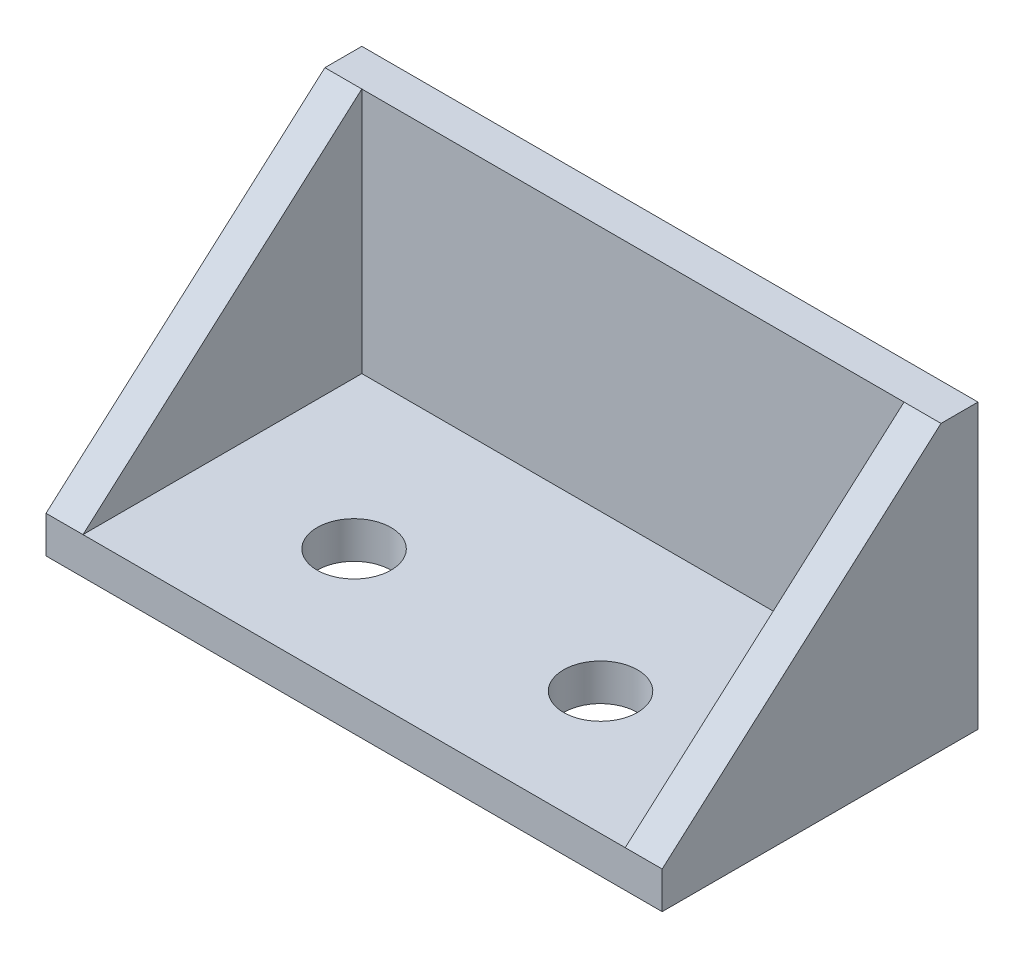
ISO-10303-21;
HEADER;
FILE_DESCRIPTION(('STEP AP214'),'2;1');
FILE_NAME('part.step','',(''),(''),'','','');
FILE_SCHEMA(('AUTOMOTIVE_DESIGN { 1 0 10303 214 1 1 1 1 }'));
ENDSEC;
DATA;
#1=APPLICATION_CONTEXT('core data for automotive mechanical design processes');
#2=APPLICATION_PROTOCOL_DEFINITION('international standard','automotive_design',2000,#1);
#3=PRODUCT_CONTEXT('',#1,'mechanical');
#4=PRODUCT('Part','Part','',(#3));
#5=PRODUCT_RELATED_PRODUCT_CATEGORY('part','',(#4));
#6=PRODUCT_DEFINITION_FORMATION('','',#4);
#7=PRODUCT_DEFINITION_CONTEXT('part definition',#1,'design');
#8=PRODUCT_DEFINITION('design','',#6,#7);
#9=PRODUCT_DEFINITION_SHAPE('','',#8);
#10=(LENGTH_UNIT() NAMED_UNIT(*) SI_UNIT(.MILLI.,.METRE.));
#11=(NAMED_UNIT(*) PLANE_ANGLE_UNIT() SI_UNIT($,.RADIAN.));
#12=(NAMED_UNIT(*) SI_UNIT($,.STERADIAN.) SOLID_ANGLE_UNIT());
#13=UNCERTAINTY_MEASURE_WITH_UNIT(LENGTH_MEASURE(1.E-05),#10,'distance_accuracy_value','');
#14=(GEOMETRIC_REPRESENTATION_CONTEXT(3) GLOBAL_UNCERTAINTY_ASSIGNED_CONTEXT((#13)) GLOBAL_UNIT_ASSIGNED_CONTEXT((#10,
#11,#12)) REPRESENTATION_CONTEXT('',''));
#15=CARTESIAN_POINT('',(0.,0.,0.));
#16=DIRECTION('',(0.,0.,1.));
#17=DIRECTION('',(1.,0.,0.));
#18=AXIS2_PLACEMENT_3D('',#15,#16,#17);
#19=CARTESIAN_POINT('',(0.,3.,0.));
#20=DIRECTION('',(0.,-1.,0.));
#21=DIRECTION('',(0.,0.,-1.));
#22=AXIS2_PLACEMENT_3D('',#19,#20,#21);
#23=PLANE('',#22);
#24=CARTESIAN_POINT('',(-10.,3.,10.));
#25=DIRECTION('',(0.,1.,0.));
#26=DIRECTION('',(0.,0.,1.));
#27=AXIS2_PLACEMENT_3D('',#24,#25,#26);
#28=CIRCLE('',#27,3.);
#29=CARTESIAN_POINT('',(-10.,3.,13.));
#30=VERTEX_POINT('',#29);
#31=EDGE_CURVE('E231',#30,#30,#28,.T.);
#32=ORIENTED_EDGE('',*,*,#31,.F.);
#33=EDGE_LOOP('',(#32));
#34=FACE_BOUND('',#33,.T.);
#35=CARTESIAN_POINT('',(10.,3.,10.));
#36=DIRECTION('',(0.,1.,0.));
#37=DIRECTION('',(0.,0.,-1.));
#38=AXIS2_PLACEMENT_3D('',#35,#36,#37);
#39=CIRCLE('',#38,3.);
#40=CARTESIAN_POINT('',(10.,3.,7.));
#41=VERTEX_POINT('',#40);
#42=EDGE_CURVE('E223',#41,#41,#39,.T.);
#43=ORIENTED_EDGE('',*,*,#42,.F.);
#44=EDGE_LOOP('',(#43));
#45=FACE_BOUND('',#44,.T.);
#46=DIRECTION('',(0.,0.,1.));
#47=VECTOR('',#46,1.);
#48=CARTESIAN_POINT('',(22.,3.,20.));
#49=LINE('',#48,#47);
#50=CARTESIAN_POINT('',(22.,3.,-2.63));
#51=VERTEX_POINT('',#50);
#52=CARTESIAN_POINT('',(22.,3.,20.));
#53=VERTEX_POINT('',#52);
#54=EDGE_CURVE('E110',#51,#53,#49,.T.);
#55=ORIENTED_EDGE('',*,*,#54,.F.);
#56=DIRECTION('',(1.,0.,0.));
#57=VECTOR('',#56,1.);
#58=CARTESIAN_POINT('',(-25.,3.,-2.63));
#59=LINE('',#58,#57);
#60=CARTESIAN_POINT('',(-22.,3.,-2.63));
#61=VERTEX_POINT('',#60);
#62=EDGE_CURVE('E135',#61,#51,#59,.T.);
#63=ORIENTED_EDGE('',*,*,#62,.F.);
#64=DIRECTION('',(0.,0.,1.));
#65=VECTOR('',#64,1.);
#66=CARTESIAN_POINT('',(-22.,3.,20.));
#67=LINE('',#66,#65);
#68=CARTESIAN_POINT('',(-22.,3.,20.));
#69=VERTEX_POINT('',#68);
#70=EDGE_CURVE('E205',#61,#69,#67,.T.);
#71=ORIENTED_EDGE('',*,*,#70,.T.);
#72=DIRECTION('',(1.,0.,0.));
#73=VECTOR('',#72,1.);
#74=CARTESIAN_POINT('',(-25.,3.,20.));
#75=LINE('',#74,#73);
#76=EDGE_CURVE('E162',#69,#53,#75,.T.);
#77=ORIENTED_EDGE('',*,*,#76,.T.);
#78=EDGE_LOOP('',(#55,#63,#71,#77));
#79=FACE_BOUND('',#78,.T.);
#80=ADVANCED_FACE('F39',(#34,#45,#79),#23,.F.);
#81=CARTESIAN_POINT('',(-25.,23.,-2.63));
#82=DIRECTION('',(0.,0.,-1.));
#83=DIRECTION('',(-1.,0.,0.));
#84=AXIS2_PLACEMENT_3D('',#81,#82,#83);
#85=PLANE('',#84);
#86=DIRECTION('',(0.,-1.,0.));
#87=VECTOR('',#86,1.);
#88=CARTESIAN_POINT('',(22.,3.,-2.63));
#89=LINE('',#88,#87);
#90=CARTESIAN_POINT('',(22.,23.,-2.63));
#91=VERTEX_POINT('',#90);
#92=EDGE_CURVE('E108',#91,#51,#89,.T.);
#93=ORIENTED_EDGE('',*,*,#92,.F.);
#94=DIRECTION('',(1.,0.,0.));
#95=VECTOR('',#94,1.);
#96=CARTESIAN_POINT('',(-25.,23.,-2.63));
#97=LINE('',#96,#95);
#98=CARTESIAN_POINT('',(-22.,23.,-2.63));
#99=VERTEX_POINT('',#98);
#100=EDGE_CURVE('E132',#99,#91,#97,.T.);
#101=ORIENTED_EDGE('',*,*,#100,.F.);
#102=DIRECTION('',(0.,-1.,0.));
#103=VECTOR('',#102,1.);
#104=CARTESIAN_POINT('',(-22.,3.,-2.63));
#105=LINE('',#104,#103);
#106=EDGE_CURVE('E206',#99,#61,#105,.T.);
#107=ORIENTED_EDGE('',*,*,#106,.T.);
#108=ORIENTED_EDGE('',*,*,#62,.T.);
#109=EDGE_LOOP('',(#93,#101,#107,#108));
#110=FACE_BOUND('',#109,.T.);
#111=ADVANCED_FACE('F130',(#110),#85,.F.);
#112=CARTESIAN_POINT('',(-25.,3.,-5.63));
#113=DIRECTION('',(0.,0.,-1.));
#114=DIRECTION('',(-1.,0.,0.));
#115=AXIS2_PLACEMENT_3D('',#112,#113,#114);
#116=PLANE('',#115);
#117=DIRECTION('',(1.,0.,0.));
#118=VECTOR('',#117,1.);
#119=CARTESIAN_POINT('',(-25.,0.,-5.63));
#120=LINE('',#119,#118);
#121=CARTESIAN_POINT('',(-25.,0.,-5.63));
#122=VERTEX_POINT('',#121);
#123=CARTESIAN_POINT('',(25.,0.,-5.63));
#124=VERTEX_POINT('',#123);
#125=EDGE_CURVE('E156',#122,#124,#120,.T.);
#126=ORIENTED_EDGE('',*,*,#125,.F.);
#127=DIRECTION('',(0.,-1.,0.));
#128=VECTOR('',#127,1.);
#129=CARTESIAN_POINT('',(-25.,3.,-5.63));
#130=LINE('',#129,#128);
#131=CARTESIAN_POINT('',(-25.,23.,-5.63));
#132=VERTEX_POINT('',#131);
#133=EDGE_CURVE('E11',#132,#122,#130,.T.);
#134=ORIENTED_EDGE('',*,*,#133,.F.);
#135=DIRECTION('',(-1.,0.,0.));
#136=VECTOR('',#135,1.);
#137=CARTESIAN_POINT('',(-25.,23.,-5.63));
#138=LINE('',#137,#136);
#139=CARTESIAN_POINT('',(25.,23.,-5.63));
#140=VERTEX_POINT('',#139);
#141=EDGE_CURVE('E152',#140,#132,#138,.T.);
#142=ORIENTED_EDGE('',*,*,#141,.F.);
#143=DIRECTION('',(0.,-1.,0.));
#144=VECTOR('',#143,1.);
#145=CARTESIAN_POINT('',(25.,3.,-5.63));
#146=LINE('',#145,#144);
#147=EDGE_CURVE('E43',#140,#124,#146,.T.);
#148=ORIENTED_EDGE('',*,*,#147,.T.);
#149=EDGE_LOOP('',(#126,#134,#142,#148));
#150=FACE_BOUND('',#149,.T.);
#151=ADVANCED_FACE('F41',(#150),#116,.T.);
#152=CARTESIAN_POINT('',(-25.,3.,-5.63));
#153=DIRECTION('',(1.,0.,0.));
#154=DIRECTION('',(0.,0.,-1.));
#155=AXIS2_PLACEMENT_3D('',#152,#153,#154);
#156=PLANE('',#155);
#157=DIRECTION('',(0.,-1.,0.));
#158=VECTOR('',#157,1.);
#159=CARTESIAN_POINT('',(-25.,3.,20.));
#160=LINE('',#159,#158);
#161=CARTESIAN_POINT('',(-25.,3.,20.));
#162=VERTEX_POINT('',#161);
#163=CARTESIAN_POINT('',(-25.,0.,20.));
#164=VERTEX_POINT('',#163);
#165=EDGE_CURVE('E49',#162,#164,#160,.T.);
#166=ORIENTED_EDGE('',*,*,#165,.F.);
#167=DIRECTION('',(0.,0.662223738031202,-0.749306159582305));
#168=VECTOR('',#167,1.);
#169=CARTESIAN_POINT('',(-25.,23.,-2.63));
#170=LINE('',#169,#168);
#171=CARTESIAN_POINT('',(-25.,23.,-2.63));
#172=VERTEX_POINT('',#171);
#173=EDGE_CURVE('E201',#162,#172,#170,.T.);
#174=ORIENTED_EDGE('',*,*,#173,.T.);
#175=DIRECTION('',(0.,0.,1.));
#176=VECTOR('',#175,1.);
#177=CARTESIAN_POINT('',(-25.,23.,-5.63));
#178=LINE('',#177,#176);
#179=EDGE_CURVE('E142',#132,#172,#178,.T.);
#180=ORIENTED_EDGE('',*,*,#179,.F.);
#181=ORIENTED_EDGE('',*,*,#133,.T.);
#182=DIRECTION('',(0.,0.,1.));
#183=VECTOR('',#182,1.);
#184=CARTESIAN_POINT('',(-25.,0.,-5.63));
#185=LINE('',#184,#183);
#186=EDGE_CURVE('E174',#122,#164,#185,.T.);
#187=ORIENTED_EDGE('',*,*,#186,.T.);
#188=EDGE_LOOP('',(#166,#174,#180,#181,#187));
#189=FACE_BOUND('',#188,.T.);
#190=ADVANCED_FACE('F193',(#189),#156,.F.);
#191=CARTESIAN_POINT('',(-25.,3.,20.));
#192=DIRECTION('',(0.,0.,-1.));
#193=DIRECTION('',(-1.,0.,0.));
#194=AXIS2_PLACEMENT_3D('',#191,#192,#193);
#195=PLANE('',#194);
#196=DIRECTION('',(1.,0.,0.));
#197=VECTOR('',#196,1.);
#198=CARTESIAN_POINT('',(-25.,0.,20.));
#199=LINE('',#198,#197);
#200=CARTESIAN_POINT('',(25.,0.,20.));
#201=VERTEX_POINT('',#200);
#202=EDGE_CURVE('E170',#164,#201,#199,.T.);
#203=ORIENTED_EDGE('',*,*,#202,.T.);
#204=DIRECTION('',(0.,-1.,0.));
#205=VECTOR('',#204,1.);
#206=CARTESIAN_POINT('',(25.,3.,20.));
#207=LINE('',#206,#205);
#208=CARTESIAN_POINT('',(25.,3.,20.));
#209=VERTEX_POINT('',#208);
#210=EDGE_CURVE('E179',#209,#201,#207,.T.);
#211=ORIENTED_EDGE('',*,*,#210,.F.);
#212=DIRECTION('',(1.,0.,0.));
#213=VECTOR('',#212,1.);
#214=CARTESIAN_POINT('',(22.,3.,20.));
#215=LINE('',#214,#213);
#216=EDGE_CURVE('E125',#53,#209,#215,.T.);
#217=ORIENTED_EDGE('',*,*,#216,.F.);
#218=ORIENTED_EDGE('',*,*,#76,.F.);
#219=EDGE_CURVE('E159',#162,#69,#75,.T.);
#220=ORIENTED_EDGE('',*,*,#219,.F.);
#221=ORIENTED_EDGE('',*,*,#165,.T.);
#222=EDGE_LOOP('',(#203,#211,#217,#218,#220,#221));
#223=FACE_BOUND('',#222,.T.);
#224=ADVANCED_FACE('F197',(#223),#195,.F.);
#225=CARTESIAN_POINT('',(25.,3.,-5.63));
#226=DIRECTION('',(1.,0.,0.));
#227=DIRECTION('',(0.,0.,-1.));
#228=AXIS2_PLACEMENT_3D('',#225,#226,#227);
#229=PLANE('',#228);
#230=DIRECTION('',(0.,0.,1.));
#231=VECTOR('',#230,1.);
#232=CARTESIAN_POINT('',(25.,0.,-5.63));
#233=LINE('',#232,#231);
#234=EDGE_CURVE('E166',#124,#201,#233,.T.);
#235=ORIENTED_EDGE('',*,*,#234,.F.);
#236=ORIENTED_EDGE('',*,*,#147,.F.);
#237=DIRECTION('',(0.,0.,-1.));
#238=VECTOR('',#237,1.);
#239=CARTESIAN_POINT('',(25.,23.,-5.63));
#240=LINE('',#239,#238);
#241=CARTESIAN_POINT('',(25.,23.,-2.63));
#242=VERTEX_POINT('',#241);
#243=EDGE_CURVE('E146',#242,#140,#240,.T.);
#244=ORIENTED_EDGE('',*,*,#243,.F.);
#245=DIRECTION('',(0.,0.662223738031202,-0.749306159582305));
#246=VECTOR('',#245,1.);
#247=CARTESIAN_POINT('',(25.,23.,-2.63));
#248=LINE('',#247,#246);
#249=EDGE_CURVE('E119',#209,#242,#248,.T.);
#250=ORIENTED_EDGE('',*,*,#249,.F.);
#251=ORIENTED_EDGE('',*,*,#210,.T.);
#252=EDGE_LOOP('',(#235,#236,#244,#250,#251));
#253=FACE_BOUND('',#252,.T.);
#254=ADVANCED_FACE('F188',(#253),#229,.T.);
#255=CARTESIAN_POINT('',(0.,0.,0.));
#256=DIRECTION('',(0.,-1.,0.));
#257=DIRECTION('',(0.,0.,-1.));
#258=AXIS2_PLACEMENT_3D('',#255,#256,#257);
#259=PLANE('',#258);
#260=CARTESIAN_POINT('',(-10.,0.,10.));
#261=DIRECTION('',(0.,1.,0.));
#262=DIRECTION('',(0.,0.,1.));
#263=AXIS2_PLACEMENT_3D('',#260,#261,#262);
#264=CIRCLE('',#263,3.);
#265=CARTESIAN_POINT('',(-10.,0.,13.));
#266=VERTEX_POINT('',#265);
#267=EDGE_CURVE('E220',#266,#266,#264,.T.);
#268=ORIENTED_EDGE('',*,*,#267,.T.);
#269=EDGE_LOOP('',(#268));
#270=FACE_BOUND('',#269,.T.);
#271=CARTESIAN_POINT('',(10.,0.,10.));
#272=DIRECTION('',(0.,1.,0.));
#273=DIRECTION('',(0.,0.,-1.));
#274=AXIS2_PLACEMENT_3D('',#271,#272,#273);
#275=CIRCLE('',#274,3.);
#276=CARTESIAN_POINT('',(10.,0.,7.));
#277=VERTEX_POINT('',#276);
#278=EDGE_CURVE('E227',#277,#277,#275,.T.);
#279=ORIENTED_EDGE('',*,*,#278,.T.);
#280=EDGE_LOOP('',(#279));
#281=FACE_BOUND('',#280,.T.);
#282=ORIENTED_EDGE('',*,*,#125,.T.);
#283=ORIENTED_EDGE('',*,*,#234,.T.);
#284=ORIENTED_EDGE('',*,*,#202,.F.);
#285=ORIENTED_EDGE('',*,*,#186,.F.);
#286=EDGE_LOOP('',(#282,#283,#284,#285));
#287=FACE_BOUND('',#286,.T.);
#288=ADVANCED_FACE('F191',(#270,#281,#287),#259,.T.);
#289=CARTESIAN_POINT('',(0.,23.,0.));
#290=DIRECTION('',(0.,1.,0.));
#291=DIRECTION('',(0.,0.,1.));
#292=AXIS2_PLACEMENT_3D('',#289,#290,#291);
#293=PLANE('',#292);
#294=ORIENTED_EDGE('',*,*,#179,.T.);
#295=EDGE_CURVE('E140',#172,#99,#97,.T.);
#296=ORIENTED_EDGE('',*,*,#295,.T.);
#297=ORIENTED_EDGE('',*,*,#100,.T.);
#298=DIRECTION('',(1.,0.,0.));
#299=VECTOR('',#298,1.);
#300=CARTESIAN_POINT('',(22.,23.,-2.63));
#301=LINE('',#300,#299);
#302=EDGE_CURVE('E116',#91,#242,#301,.T.);
#303=ORIENTED_EDGE('',*,*,#302,.T.);
#304=ORIENTED_EDGE('',*,*,#243,.T.);
#305=ORIENTED_EDGE('',*,*,#141,.T.);
#306=EDGE_LOOP('',(#294,#296,#297,#303,#304,#305));
#307=FACE_BOUND('',#306,.T.);
#308=ADVANCED_FACE('F139',(#307),#293,.T.);
#309=CARTESIAN_POINT('',(-22.,23.,-2.63));
#310=DIRECTION('',(0.,0.749306159582305,0.662223738031202));
#311=DIRECTION('',(0.,-0.662223738031202,0.749306159582305));
#312=AXIS2_PLACEMENT_3D('',#309,#310,#311);
#313=PLANE('',#312);
#314=ORIENTED_EDGE('',*,*,#173,.F.);
#315=ORIENTED_EDGE('',*,*,#219,.T.);
#316=DIRECTION('',(0.,0.662223738031202,-0.749306159582305));
#317=VECTOR('',#316,1.);
#318=CARTESIAN_POINT('',(-22.,23.,-2.63));
#319=LINE('',#318,#317);
#320=EDGE_CURVE('E57',#69,#99,#319,.T.);
#321=ORIENTED_EDGE('',*,*,#320,.T.);
#322=ORIENTED_EDGE('',*,*,#295,.F.);
#323=EDGE_LOOP('',(#314,#315,#321,#322));
#324=FACE_BOUND('',#323,.T.);
#325=ADVANCED_FACE('F200',(#324),#313,.T.);
#326=CARTESIAN_POINT('',(-22.,0.,0.));
#327=DIRECTION('',(-1.,0.,0.));
#328=DIRECTION('',(0.,0.,1.));
#329=AXIS2_PLACEMENT_3D('',#326,#327,#328);
#330=PLANE('',#329);
#331=ORIENTED_EDGE('',*,*,#106,.F.);
#332=ORIENTED_EDGE('',*,*,#320,.F.);
#333=ORIENTED_EDGE('',*,*,#70,.F.);
#334=EDGE_LOOP('',(#331,#332,#333));
#335=FACE_BOUND('',#334,.T.);
#336=ADVANCED_FACE('F204',(#335),#330,.F.);
#337=CARTESIAN_POINT('',(22.,23.,-2.63));
#338=DIRECTION('',(0.,-0.749306159582305,-0.662223738031202));
#339=DIRECTION('',(0.,0.662223738031202,-0.749306159582305));
#340=AXIS2_PLACEMENT_3D('',#337,#338,#339);
#341=PLANE('',#340);
#342=ORIENTED_EDGE('',*,*,#249,.T.);
#343=ORIENTED_EDGE('',*,*,#302,.F.);
#344=DIRECTION('',(0.,0.662223738031202,-0.749306159582305));
#345=VECTOR('',#344,1.);
#346=CARTESIAN_POINT('',(22.,23.,-2.63));
#347=LINE('',#346,#345);
#348=EDGE_CURVE('E104',#53,#91,#347,.T.);
#349=ORIENTED_EDGE('',*,*,#348,.F.);
#350=ORIENTED_EDGE('',*,*,#216,.T.);
#351=EDGE_LOOP('',(#342,#343,#349,#350));
#352=FACE_BOUND('',#351,.T.);
#353=ADVANCED_FACE('F117',(#352),#341,.F.);
#354=CARTESIAN_POINT('',(22.,0.,0.));
#355=DIRECTION('',(1.,0.,0.));
#356=DIRECTION('',(0.,0.,1.));
#357=AXIS2_PLACEMENT_3D('',#354,#355,#356);
#358=PLANE('',#357);
#359=ORIENTED_EDGE('',*,*,#92,.T.);
#360=ORIENTED_EDGE('',*,*,#54,.T.);
#361=ORIENTED_EDGE('',*,*,#348,.T.);
#362=EDGE_LOOP('',(#359,#360,#361));
#363=FACE_BOUND('',#362,.T.);
#364=ADVANCED_FACE('F106',(#363),#358,.F.);
#365=CARTESIAN_POINT('',(10.,0.,10.));
#366=DIRECTION('',(0.,1.,0.));
#367=DIRECTION('',(0.,0.,1.));
#368=AXIS2_PLACEMENT_3D('',#365,#366,#367);
#369=CYLINDRICAL_SURFACE('',#368,3.);
#370=ORIENTED_EDGE('',*,*,#278,.F.);
#371=EDGE_LOOP('',(#370));
#372=FACE_BOUND('',#371,.T.);
#373=ORIENTED_EDGE('',*,*,#42,.T.);
#374=EDGE_LOOP('',(#373));
#375=FACE_BOUND('',#374,.T.);
#376=ADVANCED_FACE('F244',(#372,#375),#369,.F.);
#377=CARTESIAN_POINT('',(-10.,0.,10.));
#378=DIRECTION('',(0.,1.,0.));
#379=DIRECTION('',(0.,0.,1.));
#380=AXIS2_PLACEMENT_3D('',#377,#378,#379);
#381=CYLINDRICAL_SURFACE('',#380,3.);
#382=ORIENTED_EDGE('',*,*,#267,.F.);
#383=EDGE_LOOP('',(#382));
#384=FACE_BOUND('',#383,.T.);
#385=ORIENTED_EDGE('',*,*,#31,.T.);
#386=EDGE_LOOP('',(#385));
#387=FACE_BOUND('',#386,.T.);
#388=ADVANCED_FACE('F241',(#384,#387),#381,.F.);
#389=CLOSED_SHELL('',(#80,#111,#151,#190,#224,#254,#288,#308,#325,#336,#353,#364,#376,#388));
#390=MANIFOLD_SOLID_BREP('B2',#389);
#391=ADVANCED_BREP_SHAPE_REPRESENTATION('',(#18,#390),#14);
#392=SHAPE_DEFINITION_REPRESENTATION(#9,#391);
ENDSEC;
END-ISO-10303-21;
